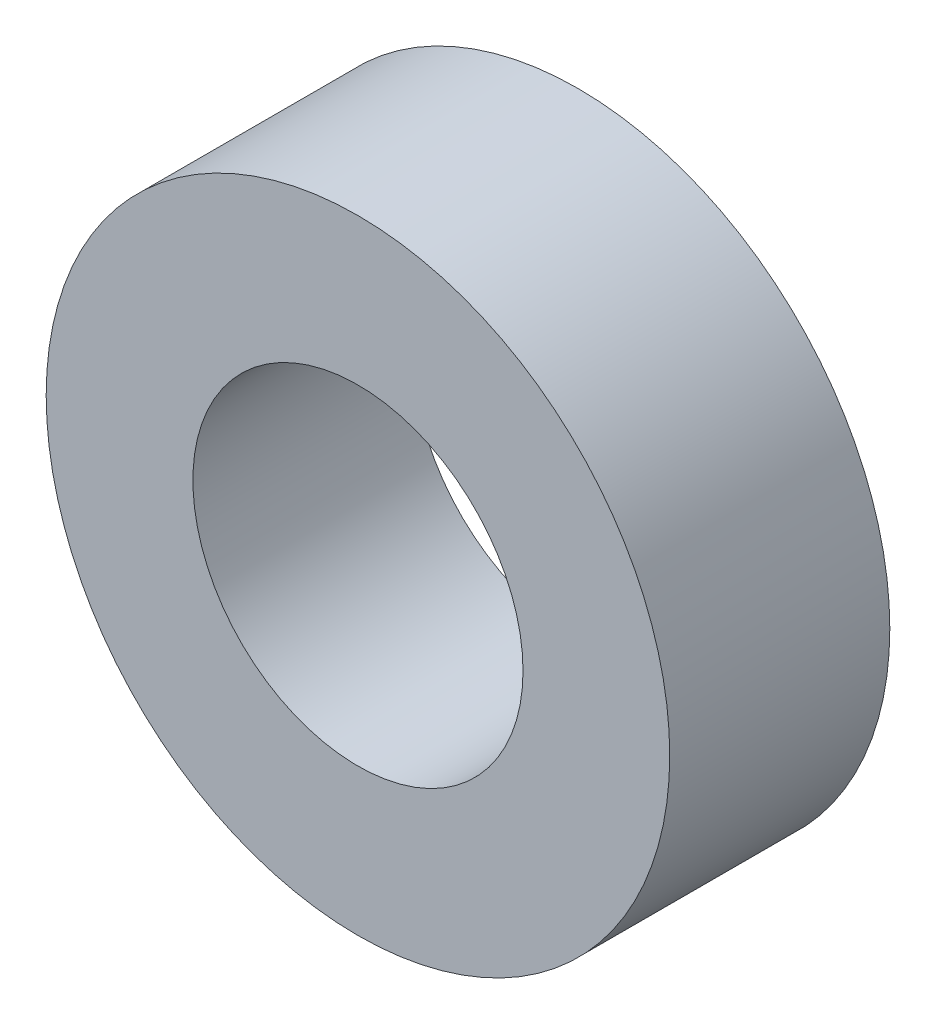
ISO-10303-21;
HEADER;
FILE_DESCRIPTION(('STEP AP214'),'2;1');
FILE_NAME('part.step','',(''),(''),'','','');
FILE_SCHEMA(('AUTOMOTIVE_DESIGN { 1 0 10303 214 1 1 1 1 }'));
ENDSEC;
DATA;
#1=APPLICATION_CONTEXT('core data for automotive mechanical design processes');
#2=APPLICATION_PROTOCOL_DEFINITION('international standard','automotive_design',2000,#1);
#3=PRODUCT_CONTEXT('',#1,'mechanical');
#4=PRODUCT('Part','Part','',(#3));
#5=PRODUCT_RELATED_PRODUCT_CATEGORY('part','',(#4));
#6=PRODUCT_DEFINITION_FORMATION('','',#4);
#7=PRODUCT_DEFINITION_CONTEXT('part definition',#1,'design');
#8=PRODUCT_DEFINITION('design','',#6,#7);
#9=PRODUCT_DEFINITION_SHAPE('','',#8);
#10=(LENGTH_UNIT() NAMED_UNIT(*) SI_UNIT(.MILLI.,.METRE.));
#11=(NAMED_UNIT(*) PLANE_ANGLE_UNIT() SI_UNIT($,.RADIAN.));
#12=(NAMED_UNIT(*) SI_UNIT($,.STERADIAN.) SOLID_ANGLE_UNIT());
#13=UNCERTAINTY_MEASURE_WITH_UNIT(LENGTH_MEASURE(1.E-05),#10,'distance_accuracy_value','');
#14=(GEOMETRIC_REPRESENTATION_CONTEXT(3) GLOBAL_UNCERTAINTY_ASSIGNED_CONTEXT((#13)) GLOBAL_UNIT_ASSIGNED_CONTEXT((#10,
#11,#12)) REPRESENTATION_CONTEXT('',''));
#15=CARTESIAN_POINT('',(0.,0.,0.));
#16=DIRECTION('',(0.,0.,1.));
#17=DIRECTION('',(1.,0.,0.));
#18=AXIS2_PLACEMENT_3D('',#15,#16,#17);
#19=CARTESIAN_POINT('',(0.,0.,6.));
#20=DIRECTION('',(0.,0.,1.));
#21=DIRECTION('',(1.,0.,0.));
#22=AXIS2_PLACEMENT_3D('',#19,#20,#21);
#23=PLANE('',#22);
#24=CARTESIAN_POINT('',(0.,0.,6.));
#25=DIRECTION('',(0.,0.,1.));
#26=DIRECTION('',(1.,0.,0.));
#27=AXIS2_PLACEMENT_3D('',#24,#25,#26);
#28=CIRCLE('',#27,8.5);
#29=CARTESIAN_POINT('',(8.5,0.,6.));
#30=VERTEX_POINT('',#29);
#31=EDGE_CURVE('E10',#30,#30,#28,.T.);
#32=ORIENTED_EDGE('',*,*,#31,.T.);
#33=EDGE_LOOP('',(#32));
#34=FACE_BOUND('',#33,.T.);
#35=CARTESIAN_POINT('',(0.,0.,6.));
#36=DIRECTION('',(0.,0.,1.));
#37=DIRECTION('',(1.,0.,0.));
#38=AXIS2_PLACEMENT_3D('',#35,#36,#37);
#39=CIRCLE('',#38,4.5);
#40=CARTESIAN_POINT('',(4.5,0.,6.));
#41=VERTEX_POINT('',#40);
#42=EDGE_CURVE('E42',#41,#41,#39,.T.);
#43=ORIENTED_EDGE('',*,*,#42,.F.);
#44=EDGE_LOOP('',(#43));
#45=FACE_BOUND('',#44,.T.);
#46=ADVANCED_FACE('F31',(#34,#45),#23,.T.);
#47=CARTESIAN_POINT('',(0.,0.,0.));
#48=DIRECTION('',(0.,0.,1.));
#49=DIRECTION('',(1.,0.,0.));
#50=AXIS2_PLACEMENT_3D('',#47,#48,#49);
#51=PLANE('',#50);
#52=CARTESIAN_POINT('',(0.,0.,0.));
#53=DIRECTION('',(0.,0.,1.));
#54=DIRECTION('',(1.,0.,0.));
#55=AXIS2_PLACEMENT_3D('',#52,#53,#54);
#56=CIRCLE('',#55,8.5);
#57=CARTESIAN_POINT('',(8.5,0.,0.));
#58=VERTEX_POINT('',#57);
#59=EDGE_CURVE('E35',#58,#58,#56,.T.);
#60=ORIENTED_EDGE('',*,*,#59,.F.);
#61=EDGE_LOOP('',(#60));
#62=FACE_BOUND('',#61,.T.);
#63=CARTESIAN_POINT('',(0.,0.,0.));
#64=DIRECTION('',(0.,0.,1.));
#65=DIRECTION('',(1.,0.,0.));
#66=AXIS2_PLACEMENT_3D('',#63,#64,#65);
#67=CIRCLE('',#66,4.5);
#68=CARTESIAN_POINT('',(4.5,0.,0.));
#69=VERTEX_POINT('',#68);
#70=EDGE_CURVE('E44',#69,#69,#67,.T.);
#71=ORIENTED_EDGE('',*,*,#70,.T.);
#72=EDGE_LOOP('',(#71));
#73=FACE_BOUND('',#72,.T.);
#74=ADVANCED_FACE('F54',(#62,#73),#51,.F.);
#75=CARTESIAN_POINT('',(0.,0.,6.));
#76=DIRECTION('',(0.,0.,-1.));
#77=DIRECTION('',(-1.,0.,0.));
#78=AXIS2_PLACEMENT_3D('',#75,#76,#77);
#79=CYLINDRICAL_SURFACE('',#78,8.5);
#80=ORIENTED_EDGE('',*,*,#31,.F.);
#81=EDGE_LOOP('',(#80));
#82=FACE_BOUND('',#81,.T.);
#83=ORIENTED_EDGE('',*,*,#59,.T.);
#84=EDGE_LOOP('',(#83));
#85=FACE_BOUND('',#84,.T.);
#86=ADVANCED_FACE('F33',(#82,#85),#79,.T.);
#87=CARTESIAN_POINT('',(0.,0.,6.));
#88=DIRECTION('',(0.,0.,-1.));
#89=DIRECTION('',(-1.,0.,0.));
#90=AXIS2_PLACEMENT_3D('',#87,#88,#89);
#91=CYLINDRICAL_SURFACE('',#90,4.5);
#92=ORIENTED_EDGE('',*,*,#42,.T.);
#93=EDGE_LOOP('',(#92));
#94=FACE_BOUND('',#93,.T.);
#95=ORIENTED_EDGE('',*,*,#70,.F.);
#96=EDGE_LOOP('',(#95));
#97=FACE_BOUND('',#96,.T.);
#98=ADVANCED_FACE('F50',(#94,#97),#91,.F.);
#99=CLOSED_SHELL('',(#46,#74,#86,#98));
#100=MANIFOLD_SOLID_BREP('B2',#99);
#101=ADVANCED_BREP_SHAPE_REPRESENTATION('',(#18,#100),#14);
#102=SHAPE_DEFINITION_REPRESENTATION(#9,#101);
ENDSEC;
END-ISO-10303-21;
